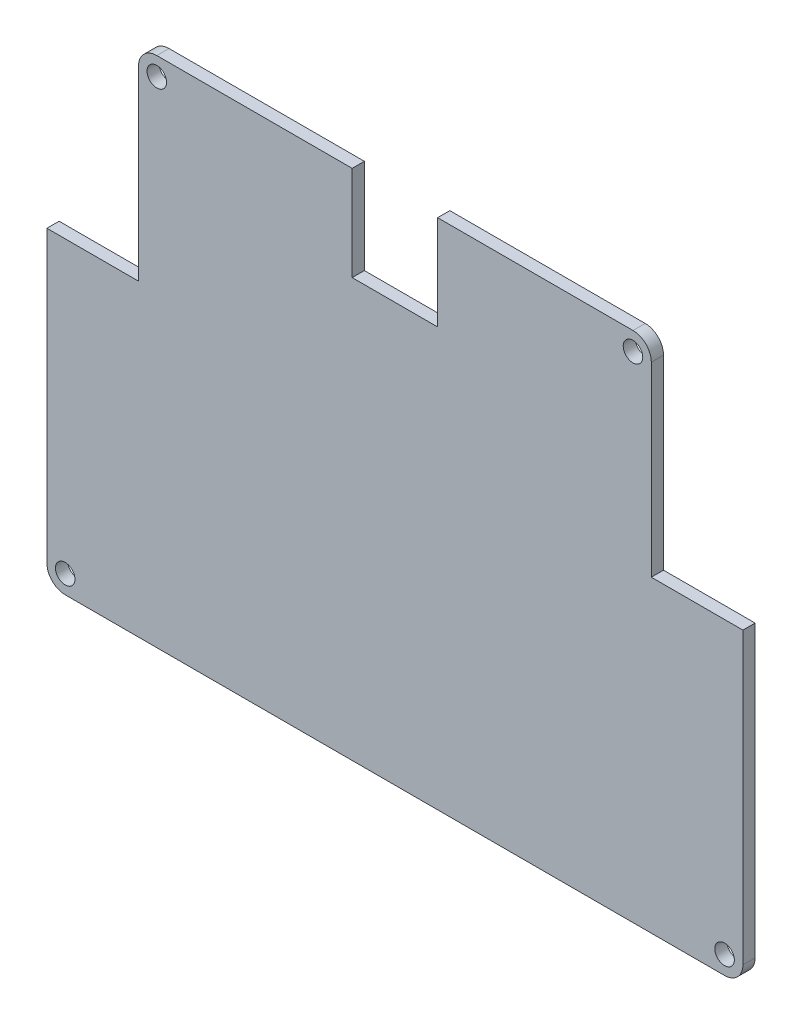
ISO-10303-21;
HEADER;
FILE_DESCRIPTION(('STEP AP214'),'2;1');
FILE_NAME('part.step','',(''),(''),'','','');
FILE_SCHEMA(('AUTOMOTIVE_DESIGN { 1 0 10303 214 1 1 1 1 }'));
ENDSEC;
DATA;
#1=APPLICATION_CONTEXT('core data for automotive mechanical design processes');
#2=APPLICATION_PROTOCOL_DEFINITION('international standard','automotive_design',2000,#1);
#3=PRODUCT_CONTEXT('',#1,'mechanical');
#4=PRODUCT('Part','Part','',(#3));
#5=PRODUCT_RELATED_PRODUCT_CATEGORY('part','',(#4));
#6=PRODUCT_DEFINITION_FORMATION('','',#4);
#7=PRODUCT_DEFINITION_CONTEXT('part definition',#1,'design');
#8=PRODUCT_DEFINITION('design','',#6,#7);
#9=PRODUCT_DEFINITION_SHAPE('','',#8);
#10=(LENGTH_UNIT() NAMED_UNIT(*) SI_UNIT(.MILLI.,.METRE.));
#11=(NAMED_UNIT(*) PLANE_ANGLE_UNIT() SI_UNIT($,.RADIAN.));
#12=(NAMED_UNIT(*) SI_UNIT($,.STERADIAN.) SOLID_ANGLE_UNIT());
#13=UNCERTAINTY_MEASURE_WITH_UNIT(LENGTH_MEASURE(1.E-05),#10,'distance_accuracy_value','');
#14=(GEOMETRIC_REPRESENTATION_CONTEXT(3) GLOBAL_UNCERTAINTY_ASSIGNED_CONTEXT((#13)) GLOBAL_UNIT_ASSIGNED_CONTEXT((#10,
#11,#12)) REPRESENTATION_CONTEXT('',''));
#15=CARTESIAN_POINT('',(0.,0.,0.));
#16=DIRECTION('',(0.,0.,1.));
#17=DIRECTION('',(1.,0.,0.));
#18=AXIS2_PLACEMENT_3D('',#15,#16,#17);
#19=CARTESIAN_POINT('',(54.,-22.030396724587,2.));
#20=DIRECTION('',(0.,0.,-1.));
#21=DIRECTION('',(-1.,0.,0.));
#22=AXIS2_PLACEMENT_3D('',#19,#20,#21);
#23=PLANE('',#22);
#24=DIRECTION('',(0.,1.,0.));
#25=VECTOR('',#24,1.);
#26=CARTESIAN_POINT('',(57.,25.469603275413,2.));
#27=LINE('',#26,#25);
#28=CARTESIAN_POINT('',(57.,-22.030396724587,2.));
#29=VERTEX_POINT('',#28);
#30=CARTESIAN_POINT('',(57.,25.469603275413,2.));
#31=VERTEX_POINT('',#30);
#32=EDGE_CURVE('E212',#29,#31,#27,.T.);
#33=ORIENTED_EDGE('',*,*,#32,.T.);
#34=DIRECTION('',(-1.,0.,0.));
#35=VECTOR('',#34,1.);
#36=CARTESIAN_POINT('',(57.,25.469603275413,2.));
#37=LINE('',#36,#35);
#38=CARTESIAN_POINT('',(42.,25.469603275413,2.));
#39=VERTEX_POINT('',#38);
#40=EDGE_CURVE('E120',#31,#39,#37,.T.);
#41=ORIENTED_EDGE('',*,*,#40,.T.);
#42=DIRECTION('',(0.,1.,0.));
#43=VECTOR('',#42,1.);
#44=CARTESIAN_POINT('',(42.,25.469603275413,2.));
#45=LINE('',#44,#43);
#46=CARTESIAN_POINT('',(42.,55.969603275413,2.));
#47=VERTEX_POINT('',#46);
#48=EDGE_CURVE('E251',#39,#47,#45,.T.);
#49=ORIENTED_EDGE('',*,*,#48,.T.);
#50=CARTESIAN_POINT('',(39.,55.969603275413,2.));
#51=DIRECTION('',(0.,0.,1.));
#52=DIRECTION('',(1.,0.,0.));
#53=AXIS2_PLACEMENT_3D('',#50,#51,#52);
#54=CIRCLE('',#53,3.);
#55=CARTESIAN_POINT('',(39.,58.969603275413,2.));
#56=VERTEX_POINT('',#55);
#57=EDGE_CURVE('E270',#47,#56,#54,.T.);
#58=ORIENTED_EDGE('',*,*,#57,.T.);
#59=DIRECTION('',(-1.,0.,0.));
#60=VECTOR('',#59,1.);
#61=CARTESIAN_POINT('',(7.,58.969603275413,2.));
#62=LINE('',#61,#60);
#63=CARTESIAN_POINT('',(7.,58.969603275413,2.));
#64=VERTEX_POINT('',#63);
#65=EDGE_CURVE('E267',#56,#64,#62,.T.);
#66=ORIENTED_EDGE('',*,*,#65,.T.);
#67=DIRECTION('',(0.,-1.,0.));
#68=VECTOR('',#67,1.);
#69=CARTESIAN_POINT('',(7.,58.969603275413,2.));
#70=LINE('',#69,#68);
#71=CARTESIAN_POINT('',(7.,43.469603275413,2.));
#72=VERTEX_POINT('',#71);
#73=EDGE_CURVE('E269',#64,#72,#70,.T.);
#74=ORIENTED_EDGE('',*,*,#73,.T.);
#75=DIRECTION('',(-1.,0.,0.));
#76=VECTOR('',#75,1.);
#77=CARTESIAN_POINT('',(-6.99999999999999,43.469603275413,2.));
#78=LINE('',#77,#76);
#79=CARTESIAN_POINT('',(-6.99999999999999,43.469603275413,2.));
#80=VERTEX_POINT('',#79);
#81=EDGE_CURVE('E272',#72,#80,#78,.T.);
#82=ORIENTED_EDGE('',*,*,#81,.T.);
#83=DIRECTION('',(0.,1.,0.));
#84=VECTOR('',#83,1.);
#85=CARTESIAN_POINT('',(-6.99999999999999,58.969603275413,2.));
#86=LINE('',#85,#84);
#87=CARTESIAN_POINT('',(-6.99999999999999,58.969603275413,2.));
#88=VERTEX_POINT('',#87);
#89=EDGE_CURVE('E278',#80,#88,#86,.T.);
#90=ORIENTED_EDGE('',*,*,#89,.T.);
#91=DIRECTION('',(-1.,0.,0.));
#92=VECTOR('',#91,1.);
#93=CARTESIAN_POINT('',(-39.,58.969603275413,2.));
#94=LINE('',#93,#92);
#95=CARTESIAN_POINT('',(-39.,58.969603275413,2.));
#96=VERTEX_POINT('',#95);
#97=EDGE_CURVE('E280',#88,#96,#94,.T.);
#98=ORIENTED_EDGE('',*,*,#97,.T.);
#99=CARTESIAN_POINT('',(-39.,55.969603275413,2.));
#100=DIRECTION('',(0.,0.,1.));
#101=DIRECTION('',(-1.,0.,0.));
#102=AXIS2_PLACEMENT_3D('',#99,#100,#101);
#103=CIRCLE('',#102,3.);
#104=CARTESIAN_POINT('',(-42.,55.969603275413,2.));
#105=VERTEX_POINT('',#104);
#106=EDGE_CURVE('E282',#96,#105,#103,.T.);
#107=ORIENTED_EDGE('',*,*,#106,.T.);
#108=DIRECTION('',(0.,-1.,0.));
#109=VECTOR('',#108,1.);
#110=CARTESIAN_POINT('',(-42.,25.469603275413,2.));
#111=LINE('',#110,#109);
#112=CARTESIAN_POINT('',(-42.,25.469603275413,2.));
#113=VERTEX_POINT('',#112);
#114=EDGE_CURVE('E284',#105,#113,#111,.T.);
#115=ORIENTED_EDGE('',*,*,#114,.T.);
#116=DIRECTION('',(-1.,0.,0.));
#117=VECTOR('',#116,1.);
#118=CARTESIAN_POINT('',(-42.,25.469603275413,2.));
#119=LINE('',#118,#117);
#120=CARTESIAN_POINT('',(-57.,25.469603275413,2.));
#121=VERTEX_POINT('',#120);
#122=EDGE_CURVE('E286',#113,#121,#119,.T.);
#123=ORIENTED_EDGE('',*,*,#122,.T.);
#124=DIRECTION('',(0.,-1.,0.));
#125=VECTOR('',#124,1.);
#126=CARTESIAN_POINT('',(-57.,25.469603275413,2.));
#127=LINE('',#126,#125);
#128=CARTESIAN_POINT('',(-57.,-22.030396724587,2.));
#129=VERTEX_POINT('',#128);
#130=EDGE_CURVE('E163',#121,#129,#127,.T.);
#131=ORIENTED_EDGE('',*,*,#130,.T.);
#132=CARTESIAN_POINT('',(-54.,-22.030396724587,2.));
#133=DIRECTION('',(0.,0.,1.));
#134=DIRECTION('',(1.,0.,0.));
#135=AXIS2_PLACEMENT_3D('',#132,#133,#134);
#136=CIRCLE('',#135,3.);
#137=CARTESIAN_POINT('',(-54.,-25.030396724587,2.));
#138=VERTEX_POINT('',#137);
#139=EDGE_CURVE('E157',#129,#138,#136,.T.);
#140=ORIENTED_EDGE('',*,*,#139,.T.);
#141=DIRECTION('',(1.,0.,0.));
#142=VECTOR('',#141,1.);
#143=CARTESIAN_POINT('',(54.,-25.030396724587,2.));
#144=LINE('',#143,#142);
#145=CARTESIAN_POINT('',(54.,-25.030396724587,2.));
#146=VERTEX_POINT('',#145);
#147=EDGE_CURVE('E161',#138,#146,#144,.T.);
#148=ORIENTED_EDGE('',*,*,#147,.T.);
#149=CARTESIAN_POINT('',(54.,-22.030396724587,2.));
#150=DIRECTION('',(0.,0.,1.));
#151=DIRECTION('',(-1.,0.,0.));
#152=AXIS2_PLACEMENT_3D('',#149,#150,#151);
#153=CIRCLE('',#152,3.);
#154=EDGE_CURVE('E53',#146,#29,#153,.T.);
#155=ORIENTED_EDGE('',*,*,#154,.T.);
#156=EDGE_LOOP('',(#33,#41,#49,#58,#66,#74,#82,#90,#98,#107,#115,#123,#131,#140,#148,#155));
#157=FACE_BOUND('',#156,.T.);
#158=CARTESIAN_POINT('',(39.,55.969603275413,2.));
#159=DIRECTION('',(0.,0.,1.));
#160=DIRECTION('',(1.,0.,0.));
#161=AXIS2_PLACEMENT_3D('',#158,#159,#160);
#162=CIRCLE('',#161,1.6);
#163=CARTESIAN_POINT('',(40.6,55.969603275413,2.));
#164=VERTEX_POINT('',#163);
#165=EDGE_CURVE('E185',#164,#164,#162,.T.);
#166=ORIENTED_EDGE('',*,*,#165,.F.);
#167=EDGE_LOOP('',(#166));
#168=FACE_BOUND('',#167,.T.);
#169=CARTESIAN_POINT('',(54.,-22.030396724587,2.));
#170=DIRECTION('',(0.,0.,1.));
#171=DIRECTION('',(1.,0.,0.));
#172=AXIS2_PLACEMENT_3D('',#169,#170,#171);
#173=CIRCLE('',#172,1.6);
#174=CARTESIAN_POINT('',(55.6,-22.030396724587,2.));
#175=VERTEX_POINT('',#174);
#176=EDGE_CURVE('E350',#175,#175,#173,.T.);
#177=ORIENTED_EDGE('',*,*,#176,.F.);
#178=EDGE_LOOP('',(#177));
#179=FACE_BOUND('',#178,.T.);
#180=CARTESIAN_POINT('',(-54.,-22.030396724587,2.));
#181=DIRECTION('',(0.,0.,1.));
#182=DIRECTION('',(-1.,0.,0.));
#183=AXIS2_PLACEMENT_3D('',#180,#181,#182);
#184=CIRCLE('',#183,1.6);
#185=CARTESIAN_POINT('',(-55.6,-22.030396724587,2.));
#186=VERTEX_POINT('',#185);
#187=EDGE_CURVE('E344',#186,#186,#184,.T.);
#188=ORIENTED_EDGE('',*,*,#187,.F.);
#189=EDGE_LOOP('',(#188));
#190=FACE_BOUND('',#189,.T.);
#191=CARTESIAN_POINT('',(-39.,55.969603275413,2.));
#192=DIRECTION('',(0.,0.,1.));
#193=DIRECTION('',(-1.,0.,0.));
#194=AXIS2_PLACEMENT_3D('',#191,#192,#193);
#195=CIRCLE('',#194,1.6);
#196=CARTESIAN_POINT('',(-40.6,55.969603275413,2.));
#197=VERTEX_POINT('',#196);
#198=EDGE_CURVE('E335',#197,#197,#195,.T.);
#199=ORIENTED_EDGE('',*,*,#198,.F.);
#200=EDGE_LOOP('',(#199));
#201=FACE_BOUND('',#200,.T.);
#202=ADVANCED_FACE('F36',(#157,#168,#179,#190,#201),#23,.F.);
#203=CARTESIAN_POINT('',(54.,-22.030396724587,0.));
#204=DIRECTION('',(0.,0.,-1.));
#205=DIRECTION('',(-1.,0.,0.));
#206=AXIS2_PLACEMENT_3D('',#203,#204,#205);
#207=PLANE('',#206);
#208=CARTESIAN_POINT('',(-54.,-22.030396724587,0.));
#209=DIRECTION('',(0.,0.,1.));
#210=DIRECTION('',(-1.,0.,0.));
#211=AXIS2_PLACEMENT_3D('',#208,#209,#210);
#212=CIRCLE('',#211,1.6);
#213=CARTESIAN_POINT('',(-55.6,-22.030396724587,0.));
#214=VERTEX_POINT('',#213);
#215=EDGE_CURVE('E341',#214,#214,#212,.T.);
#216=ORIENTED_EDGE('',*,*,#215,.T.);
#217=EDGE_LOOP('',(#216));
#218=FACE_BOUND('',#217,.T.);
#219=CARTESIAN_POINT('',(39.,55.969603275413,0.));
#220=DIRECTION('',(0.,0.,1.));
#221=DIRECTION('',(1.,0.,0.));
#222=AXIS2_PLACEMENT_3D('',#219,#220,#221);
#223=CIRCLE('',#222,1.6);
#224=CARTESIAN_POINT('',(40.6,55.969603275413,0.));
#225=VERTEX_POINT('',#224);
#226=EDGE_CURVE('E353',#225,#225,#223,.T.);
#227=ORIENTED_EDGE('',*,*,#226,.T.);
#228=EDGE_LOOP('',(#227));
#229=FACE_BOUND('',#228,.T.);
#230=DIRECTION('',(0.,1.,0.));
#231=VECTOR('',#230,1.);
#232=CARTESIAN_POINT('',(57.,25.469603275413,0.));
#233=LINE('',#232,#231);
#234=CARTESIAN_POINT('',(57.,-22.030396724587,0.));
#235=VERTEX_POINT('',#234);
#236=CARTESIAN_POINT('',(57.,25.469603275413,0.));
#237=VERTEX_POINT('',#236);
#238=EDGE_CURVE('E181',#235,#237,#233,.T.);
#239=ORIENTED_EDGE('',*,*,#238,.F.);
#240=CARTESIAN_POINT('',(54.,-22.030396724587,0.));
#241=DIRECTION('',(0.,0.,1.));
#242=DIRECTION('',(-1.,0.,0.));
#243=AXIS2_PLACEMENT_3D('',#240,#241,#242);
#244=CIRCLE('',#243,3.);
#245=CARTESIAN_POINT('',(54.,-25.030396724587,0.));
#246=VERTEX_POINT('',#245);
#247=EDGE_CURVE('E112',#246,#235,#244,.T.);
#248=ORIENTED_EDGE('',*,*,#247,.F.);
#249=DIRECTION('',(1.,0.,0.));
#250=VECTOR('',#249,1.);
#251=CARTESIAN_POINT('',(54.,-25.030396724587,0.));
#252=LINE('',#251,#250);
#253=CARTESIAN_POINT('',(-54.,-25.030396724587,0.));
#254=VERTEX_POINT('',#253);
#255=EDGE_CURVE('E106',#254,#246,#252,.T.);
#256=ORIENTED_EDGE('',*,*,#255,.F.);
#257=CARTESIAN_POINT('',(-54.,-22.030396724587,0.));
#258=DIRECTION('',(0.,0.,1.));
#259=DIRECTION('',(1.,0.,0.));
#260=AXIS2_PLACEMENT_3D('',#257,#258,#259);
#261=CIRCLE('',#260,3.);
#262=CARTESIAN_POINT('',(-57.,-22.030396724587,0.));
#263=VERTEX_POINT('',#262);
#264=EDGE_CURVE('E171',#263,#254,#261,.T.);
#265=ORIENTED_EDGE('',*,*,#264,.F.);
#266=DIRECTION('',(0.,-1.,0.));
#267=VECTOR('',#266,1.);
#268=CARTESIAN_POINT('',(-57.,25.469603275413,0.));
#269=LINE('',#268,#267);
#270=CARTESIAN_POINT('',(-57.,25.469603275413,0.));
#271=VERTEX_POINT('',#270);
#272=EDGE_CURVE('E207',#271,#263,#269,.T.);
#273=ORIENTED_EDGE('',*,*,#272,.F.);
#274=DIRECTION('',(-1.,0.,0.));
#275=VECTOR('',#274,1.);
#276=CARTESIAN_POINT('',(-42.,25.469603275413,0.));
#277=LINE('',#276,#275);
#278=CARTESIAN_POINT('',(-42.,25.469603275413,0.));
#279=VERTEX_POINT('',#278);
#280=EDGE_CURVE('E205',#279,#271,#277,.T.);
#281=ORIENTED_EDGE('',*,*,#280,.F.);
#282=DIRECTION('',(0.,-1.,0.));
#283=VECTOR('',#282,1.);
#284=CARTESIAN_POINT('',(-42.,25.469603275413,0.));
#285=LINE('',#284,#283);
#286=CARTESIAN_POINT('',(-42.,55.969603275413,0.));
#287=VERTEX_POINT('',#286);
#288=EDGE_CURVE('E203',#287,#279,#285,.T.);
#289=ORIENTED_EDGE('',*,*,#288,.F.);
#290=CARTESIAN_POINT('',(-39.,55.969603275413,0.));
#291=DIRECTION('',(0.,0.,1.));
#292=DIRECTION('',(-1.,0.,0.));
#293=AXIS2_PLACEMENT_3D('',#290,#291,#292);
#294=CIRCLE('',#293,3.);
#295=CARTESIAN_POINT('',(-39.,58.969603275413,0.));
#296=VERTEX_POINT('',#295);
#297=EDGE_CURVE('E201',#296,#287,#294,.T.);
#298=ORIENTED_EDGE('',*,*,#297,.F.);
#299=DIRECTION('',(-1.,0.,0.));
#300=VECTOR('',#299,1.);
#301=CARTESIAN_POINT('',(-39.,58.969603275413,0.));
#302=LINE('',#301,#300);
#303=CARTESIAN_POINT('',(-6.99999999999999,58.969603275413,0.));
#304=VERTEX_POINT('',#303);
#305=EDGE_CURVE('E199',#304,#296,#302,.T.);
#306=ORIENTED_EDGE('',*,*,#305,.F.);
#307=DIRECTION('',(0.,1.,0.));
#308=VECTOR('',#307,1.);
#309=CARTESIAN_POINT('',(-6.99999999999999,58.969603275413,0.));
#310=LINE('',#309,#308);
#311=CARTESIAN_POINT('',(-6.99999999999999,43.469603275413,0.));
#312=VERTEX_POINT('',#311);
#313=EDGE_CURVE('E197',#312,#304,#310,.T.);
#314=ORIENTED_EDGE('',*,*,#313,.F.);
#315=DIRECTION('',(-1.,0.,0.));
#316=VECTOR('',#315,1.);
#317=CARTESIAN_POINT('',(-6.99999999999999,43.469603275413,0.));
#318=LINE('',#317,#316);
#319=CARTESIAN_POINT('',(7.,43.469603275413,0.));
#320=VERTEX_POINT('',#319);
#321=EDGE_CURVE('E195',#320,#312,#318,.T.);
#322=ORIENTED_EDGE('',*,*,#321,.F.);
#323=DIRECTION('',(0.,-1.,0.));
#324=VECTOR('',#323,1.);
#325=CARTESIAN_POINT('',(7.,58.969603275413,0.));
#326=LINE('',#325,#324);
#327=CARTESIAN_POINT('',(7.,58.969603275413,0.));
#328=VERTEX_POINT('',#327);
#329=EDGE_CURVE('E193',#328,#320,#326,.T.);
#330=ORIENTED_EDGE('',*,*,#329,.F.);
#331=DIRECTION('',(-1.,0.,0.));
#332=VECTOR('',#331,1.);
#333=CARTESIAN_POINT('',(7.,58.969603275413,0.));
#334=LINE('',#333,#332);
#335=CARTESIAN_POINT('',(39.,58.969603275413,0.));
#336=VERTEX_POINT('',#335);
#337=EDGE_CURVE('E191',#336,#328,#334,.T.);
#338=ORIENTED_EDGE('',*,*,#337,.F.);
#339=CARTESIAN_POINT('',(39.,55.969603275413,0.));
#340=DIRECTION('',(0.,0.,1.));
#341=DIRECTION('',(1.,0.,0.));
#342=AXIS2_PLACEMENT_3D('',#339,#340,#341);
#343=CIRCLE('',#342,3.);
#344=CARTESIAN_POINT('',(42.,55.969603275413,0.));
#345=VERTEX_POINT('',#344);
#346=EDGE_CURVE('E189',#345,#336,#343,.T.);
#347=ORIENTED_EDGE('',*,*,#346,.F.);
#348=DIRECTION('',(0.,1.,0.));
#349=VECTOR('',#348,1.);
#350=CARTESIAN_POINT('',(42.,25.469603275413,0.));
#351=LINE('',#350,#349);
#352=CARTESIAN_POINT('',(42.,25.469603275413,0.));
#353=VERTEX_POINT('',#352);
#354=EDGE_CURVE('E187',#353,#345,#351,.T.);
#355=ORIENTED_EDGE('',*,*,#354,.F.);
#356=DIRECTION('',(-1.,0.,0.));
#357=VECTOR('',#356,1.);
#358=CARTESIAN_POINT('',(57.,25.469603275413,0.));
#359=LINE('',#358,#357);
#360=EDGE_CURVE('E184',#237,#353,#359,.T.);
#361=ORIENTED_EDGE('',*,*,#360,.F.);
#362=EDGE_LOOP('',(#239,#248,#256,#265,#273,#281,#289,#298,#306,#314,#322,#330,#338,#347,#355,#361));
#363=FACE_BOUND('',#362,.T.);
#364=CARTESIAN_POINT('',(54.,-22.030396724587,0.));
#365=DIRECTION('',(0.,0.,1.));
#366=DIRECTION('',(1.,0.,0.));
#367=AXIS2_PLACEMENT_3D('',#364,#365,#366);
#368=CIRCLE('',#367,1.6);
#369=CARTESIAN_POINT('',(55.6,-22.030396724587,0.));
#370=VERTEX_POINT('',#369);
#371=EDGE_CURVE('E347',#370,#370,#368,.T.);
#372=ORIENTED_EDGE('',*,*,#371,.T.);
#373=EDGE_LOOP('',(#372));
#374=FACE_BOUND('',#373,.T.);
#375=CARTESIAN_POINT('',(-39.,55.969603275413,0.));
#376=DIRECTION('',(0.,0.,1.));
#377=DIRECTION('',(-1.,0.,0.));
#378=AXIS2_PLACEMENT_3D('',#375,#376,#377);
#379=CIRCLE('',#378,1.6);
#380=CARTESIAN_POINT('',(-40.6,55.969603275413,0.));
#381=VERTEX_POINT('',#380);
#382=EDGE_CURVE('E338',#381,#381,#379,.T.);
#383=ORIENTED_EDGE('',*,*,#382,.T.);
#384=EDGE_LOOP('',(#383));
#385=FACE_BOUND('',#384,.T.);
#386=ADVANCED_FACE('F255',(#218,#229,#363,#374,#385),#207,.T.);
#387=CARTESIAN_POINT('',(57.,25.469603275413,2.));
#388=DIRECTION('',(-1.,0.,0.));
#389=DIRECTION('',(0.,0.,1.));
#390=AXIS2_PLACEMENT_3D('',#387,#388,#389);
#391=PLANE('',#390);
#392=ORIENTED_EDGE('',*,*,#238,.T.);
#393=DIRECTION('',(0.,0.,-1.));
#394=VECTOR('',#393,1.);
#395=CARTESIAN_POINT('',(57.,25.469603275413,2.));
#396=LINE('',#395,#394);
#397=EDGE_CURVE('E11',#31,#237,#396,.T.);
#398=ORIENTED_EDGE('',*,*,#397,.F.);
#399=ORIENTED_EDGE('',*,*,#32,.F.);
#400=DIRECTION('',(0.,0.,-1.));
#401=VECTOR('',#400,1.);
#402=CARTESIAN_POINT('',(57.,-22.030396724587,2.));
#403=LINE('',#402,#401);
#404=EDGE_CURVE('E177',#29,#235,#403,.T.);
#405=ORIENTED_EDGE('',*,*,#404,.T.);
#406=EDGE_LOOP('',(#392,#398,#399,#405));
#407=FACE_BOUND('',#406,.T.);
#408=ADVANCED_FACE('F38',(#407),#391,.F.);
#409=CARTESIAN_POINT('',(57.,25.469603275413,2.));
#410=DIRECTION('',(0.,-1.,0.));
#411=DIRECTION('',(1.,0.,0.));
#412=AXIS2_PLACEMENT_3D('',#409,#410,#411);
#413=PLANE('',#412);
#414=ORIENTED_EDGE('',*,*,#360,.T.);
#415=DIRECTION('',(0.,0.,-1.));
#416=VECTOR('',#415,1.);
#417=CARTESIAN_POINT('',(42.,25.469603275413,2.));
#418=LINE('',#417,#416);
#419=EDGE_CURVE('E45',#39,#353,#418,.T.);
#420=ORIENTED_EDGE('',*,*,#419,.F.);
#421=ORIENTED_EDGE('',*,*,#40,.F.);
#422=ORIENTED_EDGE('',*,*,#397,.T.);
#423=EDGE_LOOP('',(#414,#420,#421,#422));
#424=FACE_BOUND('',#423,.T.);
#425=ADVANCED_FACE('F505',(#424),#413,.F.);
#426=CARTESIAN_POINT('',(42.,25.469603275413,2.));
#427=DIRECTION('',(-1.,0.,0.));
#428=DIRECTION('',(0.,-1.,0.));
#429=AXIS2_PLACEMENT_3D('',#426,#427,#428);
#430=PLANE('',#429);
#431=ORIENTED_EDGE('',*,*,#354,.T.);
#432=DIRECTION('',(0.,0.,-1.));
#433=VECTOR('',#432,1.);
#434=CARTESIAN_POINT('',(42.,55.969603275413,2.));
#435=LINE('',#434,#433);
#436=EDGE_CURVE('E243',#47,#345,#435,.T.);
#437=ORIENTED_EDGE('',*,*,#436,.F.);
#438=ORIENTED_EDGE('',*,*,#48,.F.);
#439=ORIENTED_EDGE('',*,*,#419,.T.);
#440=EDGE_LOOP('',(#431,#437,#438,#439));
#441=FACE_BOUND('',#440,.T.);
#442=ADVANCED_FACE('F249',(#441),#430,.F.);
#443=CARTESIAN_POINT('',(39.,55.969603275413,2.));
#444=DIRECTION('',(0.,0.,-1.));
#445=DIRECTION('',(-1.,0.,0.));
#446=AXIS2_PLACEMENT_3D('',#443,#444,#445);
#447=CYLINDRICAL_SURFACE('',#446,3.);
#448=ORIENTED_EDGE('',*,*,#346,.T.);
#449=DIRECTION('',(0.,0.,-1.));
#450=VECTOR('',#449,1.);
#451=CARTESIAN_POINT('',(39.,58.969603275413,2.));
#452=LINE('',#451,#450);
#453=EDGE_CURVE('E240',#56,#336,#452,.T.);
#454=ORIENTED_EDGE('',*,*,#453,.F.);
#455=ORIENTED_EDGE('',*,*,#57,.F.);
#456=ORIENTED_EDGE('',*,*,#436,.T.);
#457=EDGE_LOOP('',(#448,#454,#455,#456));
#458=FACE_BOUND('',#457,.T.);
#459=ADVANCED_FACE('F261',(#458),#447,.T.);
#460=CARTESIAN_POINT('',(7.,58.969603275413,2.));
#461=DIRECTION('',(0.,-1.,0.));
#462=DIRECTION('',(1.,0.,0.));
#463=AXIS2_PLACEMENT_3D('',#460,#461,#462);
#464=PLANE('',#463);
#465=ORIENTED_EDGE('',*,*,#337,.T.);
#466=DIRECTION('',(0.,0.,-1.));
#467=VECTOR('',#466,1.);
#468=CARTESIAN_POINT('',(7.,58.969603275413,2.));
#469=LINE('',#468,#467);
#470=EDGE_CURVE('E237',#64,#328,#469,.T.);
#471=ORIENTED_EDGE('',*,*,#470,.F.);
#472=ORIENTED_EDGE('',*,*,#65,.F.);
#473=ORIENTED_EDGE('',*,*,#453,.T.);
#474=EDGE_LOOP('',(#465,#471,#472,#473));
#475=FACE_BOUND('',#474,.T.);
#476=ADVANCED_FACE('F265',(#475),#464,.F.);
#477=CARTESIAN_POINT('',(7.,58.969603275413,2.));
#478=DIRECTION('',(1.,0.,0.));
#479=DIRECTION('',(0.,0.,-1.));
#480=AXIS2_PLACEMENT_3D('',#477,#478,#479);
#481=PLANE('',#480);
#482=ORIENTED_EDGE('',*,*,#329,.T.);
#483=DIRECTION('',(0.,0.,-1.));
#484=VECTOR('',#483,1.);
#485=CARTESIAN_POINT('',(7.,43.469603275413,2.));
#486=LINE('',#485,#484);
#487=EDGE_CURVE('E234',#72,#320,#486,.T.);
#488=ORIENTED_EDGE('',*,*,#487,.F.);
#489=ORIENTED_EDGE('',*,*,#73,.F.);
#490=ORIENTED_EDGE('',*,*,#470,.T.);
#491=EDGE_LOOP('',(#482,#488,#489,#490));
#492=FACE_BOUND('',#491,.T.);
#493=ADVANCED_FACE('F470',(#492),#481,.F.);
#494=CARTESIAN_POINT('',(-6.99999999999999,43.469603275413,2.));
#495=DIRECTION('',(0.,-1.,0.));
#496=DIRECTION('',(0.,0.,-1.));
#497=AXIS2_PLACEMENT_3D('',#494,#495,#496);
#498=PLANE('',#497);
#499=ORIENTED_EDGE('',*,*,#321,.T.);
#500=DIRECTION('',(0.,0.,-1.));
#501=VECTOR('',#500,1.);
#502=CARTESIAN_POINT('',(-6.99999999999999,43.469603275413,2.));
#503=LINE('',#502,#501);
#504=EDGE_CURVE('E231',#80,#312,#503,.T.);
#505=ORIENTED_EDGE('',*,*,#504,.F.);
#506=ORIENTED_EDGE('',*,*,#81,.F.);
#507=ORIENTED_EDGE('',*,*,#487,.T.);
#508=EDGE_LOOP('',(#499,#505,#506,#507));
#509=FACE_BOUND('',#508,.T.);
#510=ADVANCED_FACE('F460',(#509),#498,.F.);
#511=CARTESIAN_POINT('',(-6.99999999999999,58.969603275413,2.));
#512=DIRECTION('',(-1.,0.,0.));
#513=DIRECTION('',(0.,0.,1.));
#514=AXIS2_PLACEMENT_3D('',#511,#512,#513);
#515=PLANE('',#514);
#516=ORIENTED_EDGE('',*,*,#313,.T.);
#517=DIRECTION('',(0.,0.,-1.));
#518=VECTOR('',#517,1.);
#519=CARTESIAN_POINT('',(-6.99999999999999,58.969603275413,2.));
#520=LINE('',#519,#518);
#521=EDGE_CURVE('E228',#88,#304,#520,.T.);
#522=ORIENTED_EDGE('',*,*,#521,.F.);
#523=ORIENTED_EDGE('',*,*,#89,.F.);
#524=ORIENTED_EDGE('',*,*,#504,.T.);
#525=EDGE_LOOP('',(#516,#522,#523,#524));
#526=FACE_BOUND('',#525,.T.);
#527=ADVANCED_FACE('F450',(#526),#515,.F.);
#528=CARTESIAN_POINT('',(-39.,58.969603275413,2.));
#529=DIRECTION('',(0.,-1.,0.));
#530=DIRECTION('',(1.,0.,0.));
#531=AXIS2_PLACEMENT_3D('',#528,#529,#530);
#532=PLANE('',#531);
#533=ORIENTED_EDGE('',*,*,#305,.T.);
#534=DIRECTION('',(0.,0.,-1.));
#535=VECTOR('',#534,1.);
#536=CARTESIAN_POINT('',(-39.,58.969603275413,2.));
#537=LINE('',#536,#535);
#538=EDGE_CURVE('E225',#96,#296,#537,.T.);
#539=ORIENTED_EDGE('',*,*,#538,.F.);
#540=ORIENTED_EDGE('',*,*,#97,.F.);
#541=ORIENTED_EDGE('',*,*,#521,.T.);
#542=EDGE_LOOP('',(#533,#539,#540,#541));
#543=FACE_BOUND('',#542,.T.);
#544=ADVANCED_FACE('F440',(#543),#532,.F.);
#545=CARTESIAN_POINT('',(-39.,55.969603275413,2.));
#546=DIRECTION('',(0.,0.,-1.));
#547=DIRECTION('',(-1.,0.,0.));
#548=AXIS2_PLACEMENT_3D('',#545,#546,#547);
#549=CYLINDRICAL_SURFACE('',#548,3.);
#550=ORIENTED_EDGE('',*,*,#297,.T.);
#551=DIRECTION('',(0.,0.,-1.));
#552=VECTOR('',#551,1.);
#553=CARTESIAN_POINT('',(-42.,55.969603275413,2.));
#554=LINE('',#553,#552);
#555=EDGE_CURVE('E222',#105,#287,#554,.T.);
#556=ORIENTED_EDGE('',*,*,#555,.F.);
#557=ORIENTED_EDGE('',*,*,#106,.F.);
#558=ORIENTED_EDGE('',*,*,#538,.T.);
#559=EDGE_LOOP('',(#550,#556,#557,#558));
#560=FACE_BOUND('',#559,.T.);
#561=ADVANCED_FACE('F430',(#560),#549,.T.);
#562=CARTESIAN_POINT('',(-42.,25.469603275413,2.));
#563=DIRECTION('',(1.,0.,0.));
#564=DIRECTION('',(0.,1.,0.));
#565=AXIS2_PLACEMENT_3D('',#562,#563,#564);
#566=PLANE('',#565);
#567=ORIENTED_EDGE('',*,*,#288,.T.);
#568=DIRECTION('',(0.,0.,-1.));
#569=VECTOR('',#568,1.);
#570=CARTESIAN_POINT('',(-42.,25.469603275413,2.));
#571=LINE('',#570,#569);
#572=EDGE_CURVE('E219',#113,#279,#571,.T.);
#573=ORIENTED_EDGE('',*,*,#572,.F.);
#574=ORIENTED_EDGE('',*,*,#114,.F.);
#575=ORIENTED_EDGE('',*,*,#555,.T.);
#576=EDGE_LOOP('',(#567,#573,#574,#575));
#577=FACE_BOUND('',#576,.T.);
#578=ADVANCED_FACE('F421',(#577),#566,.F.);
#579=CARTESIAN_POINT('',(-42.,25.469603275413,2.));
#580=DIRECTION('',(0.,-1.,0.));
#581=DIRECTION('',(1.,0.,0.));
#582=AXIS2_PLACEMENT_3D('',#579,#580,#581);
#583=PLANE('',#582);
#584=ORIENTED_EDGE('',*,*,#280,.T.);
#585=DIRECTION('',(0.,0.,-1.));
#586=VECTOR('',#585,1.);
#587=CARTESIAN_POINT('',(-57.,25.469603275413,2.));
#588=LINE('',#587,#586);
#589=EDGE_CURVE('E216',#121,#271,#588,.T.);
#590=ORIENTED_EDGE('',*,*,#589,.F.);
#591=ORIENTED_EDGE('',*,*,#122,.F.);
#592=ORIENTED_EDGE('',*,*,#572,.T.);
#593=EDGE_LOOP('',(#584,#590,#591,#592));
#594=FACE_BOUND('',#593,.T.);
#595=ADVANCED_FACE('F292',(#594),#583,.F.);
#596=CARTESIAN_POINT('',(-57.,25.469603275413,2.));
#597=DIRECTION('',(1.,0.,0.));
#598=DIRECTION('',(0.,0.,-1.));
#599=AXIS2_PLACEMENT_3D('',#596,#597,#598);
#600=PLANE('',#599);
#601=ORIENTED_EDGE('',*,*,#272,.T.);
#602=DIRECTION('',(0.,0.,-1.));
#603=VECTOR('',#602,1.);
#604=CARTESIAN_POINT('',(-57.,-22.030396724587,2.));
#605=LINE('',#604,#603);
#606=EDGE_CURVE('E172',#129,#263,#605,.T.);
#607=ORIENTED_EDGE('',*,*,#606,.F.);
#608=ORIENTED_EDGE('',*,*,#130,.F.);
#609=ORIENTED_EDGE('',*,*,#589,.T.);
#610=EDGE_LOOP('',(#601,#607,#608,#609));
#611=FACE_BOUND('',#610,.T.);
#612=ADVANCED_FACE('F296',(#611),#600,.F.);
#613=CARTESIAN_POINT('',(-54.,-22.030396724587,2.));
#614=DIRECTION('',(0.,0.,-1.));
#615=DIRECTION('',(-1.,0.,0.));
#616=AXIS2_PLACEMENT_3D('',#613,#614,#615);
#617=CYLINDRICAL_SURFACE('',#616,3.);
#618=ORIENTED_EDGE('',*,*,#264,.T.);
#619=DIRECTION('',(0.,0.,-1.));
#620=VECTOR('',#619,1.);
#621=CARTESIAN_POINT('',(-54.,-25.030396724587,2.));
#622=LINE('',#621,#620);
#623=EDGE_CURVE('E168',#138,#254,#622,.T.);
#624=ORIENTED_EDGE('',*,*,#623,.F.);
#625=ORIENTED_EDGE('',*,*,#139,.F.);
#626=ORIENTED_EDGE('',*,*,#606,.T.);
#627=EDGE_LOOP('',(#618,#624,#625,#626));
#628=FACE_BOUND('',#627,.T.);
#629=ADVANCED_FACE('F169',(#628),#617,.T.);
#630=CARTESIAN_POINT('',(54.,-25.030396724587,2.));
#631=DIRECTION('',(0.,1.,0.));
#632=DIRECTION('',(-1.,0.,0.));
#633=AXIS2_PLACEMENT_3D('',#630,#631,#632);
#634=PLANE('',#633);
#635=ORIENTED_EDGE('',*,*,#255,.T.);
#636=DIRECTION('',(0.,0.,-1.));
#637=VECTOR('',#636,1.);
#638=CARTESIAN_POINT('',(54.,-25.030396724587,2.));
#639=LINE('',#638,#637);
#640=EDGE_CURVE('E173',#146,#246,#639,.T.);
#641=ORIENTED_EDGE('',*,*,#640,.F.);
#642=ORIENTED_EDGE('',*,*,#147,.F.);
#643=ORIENTED_EDGE('',*,*,#623,.T.);
#644=EDGE_LOOP('',(#635,#641,#642,#643));
#645=FACE_BOUND('',#644,.T.);
#646=ADVANCED_FACE('F175',(#645),#634,.F.);
#647=CARTESIAN_POINT('',(54.,-22.030396724587,2.));
#648=DIRECTION('',(0.,0.,-1.));
#649=DIRECTION('',(-1.,0.,0.));
#650=AXIS2_PLACEMENT_3D('',#647,#648,#649);
#651=CYLINDRICAL_SURFACE('',#650,3.);
#652=ORIENTED_EDGE('',*,*,#247,.T.);
#653=ORIENTED_EDGE('',*,*,#404,.F.);
#654=ORIENTED_EDGE('',*,*,#154,.F.);
#655=ORIENTED_EDGE('',*,*,#640,.T.);
#656=EDGE_LOOP('',(#652,#653,#654,#655));
#657=FACE_BOUND('',#656,.T.);
#658=ADVANCED_FACE('F300',(#657),#651,.T.);
#659=CARTESIAN_POINT('',(39.,55.969603275413,2.));
#660=DIRECTION('',(0.,0.,-1.));
#661=DIRECTION('',(-1.,0.,0.));
#662=AXIS2_PLACEMENT_3D('',#659,#660,#661);
#663=CYLINDRICAL_SURFACE('',#662,1.6);
#664=ORIENTED_EDGE('',*,*,#165,.T.);
#665=EDGE_LOOP('',(#664));
#666=FACE_BOUND('',#665,.T.);
#667=ORIENTED_EDGE('',*,*,#226,.F.);
#668=EDGE_LOOP('',(#667));
#669=FACE_BOUND('',#668,.T.);
#670=ADVANCED_FACE('F302',(#666,#669),#663,.F.);
#671=CARTESIAN_POINT('',(54.,-22.030396724587,2.));
#672=DIRECTION('',(0.,0.,-1.));
#673=DIRECTION('',(-1.,0.,0.));
#674=AXIS2_PLACEMENT_3D('',#671,#672,#673);
#675=CYLINDRICAL_SURFACE('',#674,1.6);
#676=ORIENTED_EDGE('',*,*,#176,.T.);
#677=EDGE_LOOP('',(#676));
#678=FACE_BOUND('',#677,.T.);
#679=ORIENTED_EDGE('',*,*,#371,.F.);
#680=EDGE_LOOP('',(#679));
#681=FACE_BOUND('',#680,.T.);
#682=ADVANCED_FACE('F308',(#678,#681),#675,.F.);
#683=CARTESIAN_POINT('',(-54.,-22.030396724587,2.));
#684=DIRECTION('',(0.,0.,-1.));
#685=DIRECTION('',(-1.,0.,0.));
#686=AXIS2_PLACEMENT_3D('',#683,#684,#685);
#687=CYLINDRICAL_SURFACE('',#686,1.6);
#688=ORIENTED_EDGE('',*,*,#187,.T.);
#689=EDGE_LOOP('',(#688));
#690=FACE_BOUND('',#689,.T.);
#691=ORIENTED_EDGE('',*,*,#215,.F.);
#692=EDGE_LOOP('',(#691));
#693=FACE_BOUND('',#692,.T.);
#694=ADVANCED_FACE('F322',(#690,#693),#687,.F.);
#695=CARTESIAN_POINT('',(-39.,55.969603275413,2.));
#696=DIRECTION('',(0.,0.,-1.));
#697=DIRECTION('',(-1.,0.,0.));
#698=AXIS2_PLACEMENT_3D('',#695,#696,#697);
#699=CYLINDRICAL_SURFACE('',#698,1.6);
#700=ORIENTED_EDGE('',*,*,#198,.T.);
#701=EDGE_LOOP('',(#700));
#702=FACE_BOUND('',#701,.T.);
#703=ORIENTED_EDGE('',*,*,#382,.F.);
#704=EDGE_LOOP('',(#703));
#705=FACE_BOUND('',#704,.T.);
#706=ADVANCED_FACE('F326',(#702,#705),#699,.F.);
#707=CLOSED_SHELL('',(#202,#386,#408,#425,#442,#459,#476,#493,#510,#527,#544,#561,#578,#595,
#612,#629,#646,#658,#670,#682,#694,#706));
#708=MANIFOLD_SOLID_BREP('B2',#707);
#709=ADVANCED_BREP_SHAPE_REPRESENTATION('',(#18,#708),#14);
#710=SHAPE_DEFINITION_REPRESENTATION(#9,#709);
ENDSEC;
END-ISO-10303-21;
